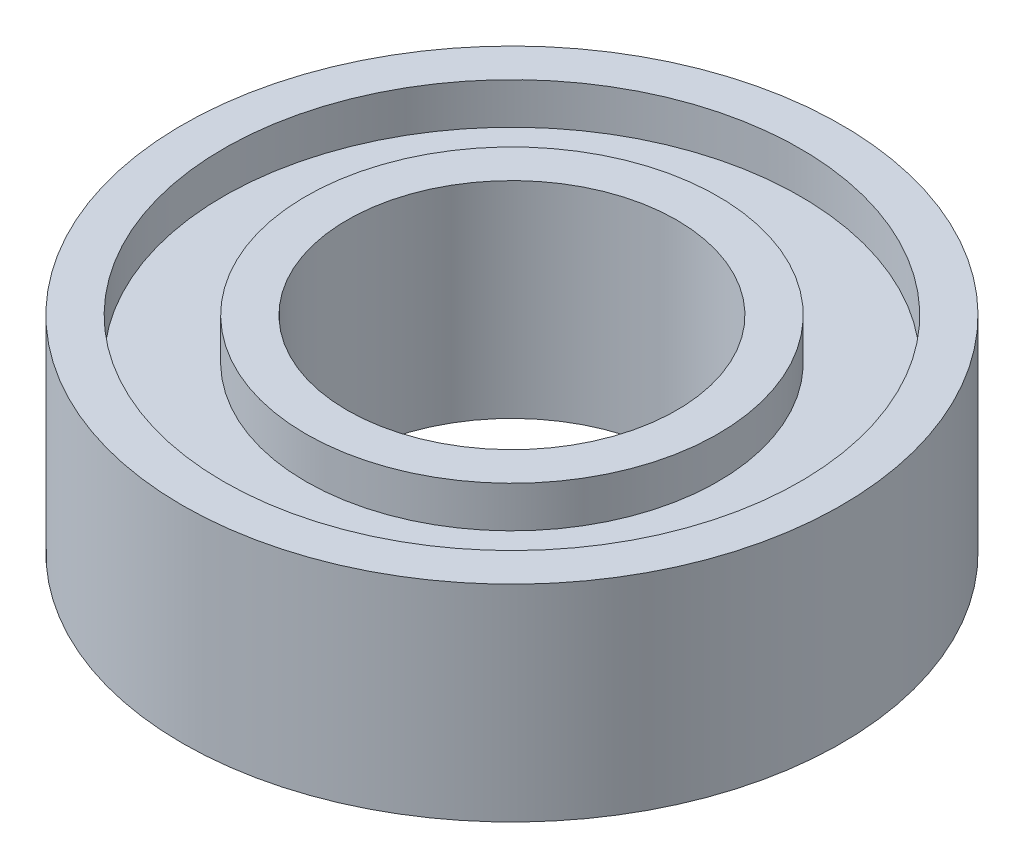
ISO-10303-21;
HEADER;
FILE_DESCRIPTION(('STEP AP214'),'2;1');
FILE_NAME('part.step','',(''),(''),'','','');
FILE_SCHEMA(('AUTOMOTIVE_DESIGN { 1 0 10303 214 1 1 1 1 }'));
ENDSEC;
DATA;
#1=APPLICATION_CONTEXT('core data for automotive mechanical design processes');
#2=APPLICATION_PROTOCOL_DEFINITION('international standard','automotive_design',2000,#1);
#3=PRODUCT_CONTEXT('',#1,'mechanical');
#4=PRODUCT('Part','Part','',(#3));
#5=PRODUCT_RELATED_PRODUCT_CATEGORY('part','',(#4));
#6=PRODUCT_DEFINITION_FORMATION('','',#4);
#7=PRODUCT_DEFINITION_CONTEXT('part definition',#1,'design');
#8=PRODUCT_DEFINITION('design','',#6,#7);
#9=PRODUCT_DEFINITION_SHAPE('','',#8);
#10=(LENGTH_UNIT() NAMED_UNIT(*) SI_UNIT(.MILLI.,.METRE.));
#11=(NAMED_UNIT(*) PLANE_ANGLE_UNIT() SI_UNIT($,.RADIAN.));
#12=(NAMED_UNIT(*) SI_UNIT($,.STERADIAN.) SOLID_ANGLE_UNIT());
#13=UNCERTAINTY_MEASURE_WITH_UNIT(LENGTH_MEASURE(1.E-05),#10,'distance_accuracy_value','');
#14=(GEOMETRIC_REPRESENTATION_CONTEXT(3) GLOBAL_UNCERTAINTY_ASSIGNED_CONTEXT((#13)) GLOBAL_UNIT_ASSIGNED_CONTEXT((#10,
#11,#12)) REPRESENTATION_CONTEXT('',''));
#15=CARTESIAN_POINT('',(0.,0.,0.));
#16=DIRECTION('',(0.,0.,1.));
#17=DIRECTION('',(1.,0.,0.));
#18=AXIS2_PLACEMENT_3D('',#15,#16,#17);
#19=CARTESIAN_POINT('',(0.,0.,0.));
#20=DIRECTION('',(0.,1.,0.));
#21=DIRECTION('',(0.,0.,1.));
#22=AXIS2_PLACEMENT_3D('',#19,#20,#21);
#23=PLANE('',#22);
#24=CARTESIAN_POINT('',(0.,0.,0.));
#25=DIRECTION('',(0.,1.,0.));
#26=DIRECTION('',(0.,0.,1.));
#27=AXIS2_PLACEMENT_3D('',#24,#25,#26);
#28=CIRCLE('',#27,4.);
#29=CARTESIAN_POINT('',(0.,0.,4.));
#30=VERTEX_POINT('',#29);
#31=EDGE_CURVE('E54',#30,#30,#28,.T.);
#32=ORIENTED_EDGE('',*,*,#31,.T.);
#33=EDGE_LOOP('',(#32));
#34=FACE_BOUND('',#33,.T.);
#35=CARTESIAN_POINT('',(0.,0.,0.));
#36=DIRECTION('',(0.,-1.,0.));
#37=DIRECTION('',(0.,0.,-1.));
#38=AXIS2_PLACEMENT_3D('',#35,#36,#37);
#39=CIRCLE('',#38,5.);
#40=CARTESIAN_POINT('',(0.,0.,-5.));
#41=VERTEX_POINT('',#40);
#42=EDGE_CURVE('E78',#41,#41,#39,.T.);
#43=ORIENTED_EDGE('',*,*,#42,.T.);
#44=EDGE_LOOP('',(#43));
#45=FACE_BOUND('',#44,.T.);
#46=ADVANCED_FACE('F41',(#34,#45),#23,.F.);
#47=CARTESIAN_POINT('',(0.,5.,0.));
#48=DIRECTION('',(0.,1.,0.));
#49=DIRECTION('',(0.,0.,1.));
#50=AXIS2_PLACEMENT_3D('',#47,#48,#49);
#51=PLANE('',#50);
#52=CARTESIAN_POINT('',(0.,5.,0.));
#53=DIRECTION('',(0.,1.,0.));
#54=DIRECTION('',(0.,0.,1.));
#55=AXIS2_PLACEMENT_3D('',#52,#53,#54);
#56=CIRCLE('',#55,4.);
#57=CARTESIAN_POINT('',(0.,5.,4.));
#58=VERTEX_POINT('',#57);
#59=EDGE_CURVE('E52',#58,#58,#56,.T.);
#60=ORIENTED_EDGE('',*,*,#59,.F.);
#61=EDGE_LOOP('',(#60));
#62=FACE_BOUND('',#61,.T.);
#63=CARTESIAN_POINT('',(0.,5.,0.));
#64=DIRECTION('',(0.,1.,0.));
#65=DIRECTION('',(0.,0.,1.));
#66=AXIS2_PLACEMENT_3D('',#63,#64,#65);
#67=CIRCLE('',#66,5.);
#68=CARTESIAN_POINT('',(0.,5.,5.));
#69=VERTEX_POINT('',#68);
#70=EDGE_CURVE('E66',#69,#69,#67,.T.);
#71=ORIENTED_EDGE('',*,*,#70,.T.);
#72=EDGE_LOOP('',(#71));
#73=FACE_BOUND('',#72,.T.);
#74=ADVANCED_FACE('F116',(#62,#73),#51,.T.);
#75=CARTESIAN_POINT('',(0.,5.,0.));
#76=DIRECTION('',(0.,1.,0.));
#77=DIRECTION('',(0.,0.,1.));
#78=AXIS2_PLACEMENT_3D('',#75,#76,#77);
#79=CIRCLE('',#78,7.);
#80=CARTESIAN_POINT('',(0.,5.,7.));
#81=VERTEX_POINT('',#80);
#82=EDGE_CURVE('E60',#81,#81,#79,.T.);
#83=ORIENTED_EDGE('',*,*,#82,.F.);
#84=EDGE_LOOP('',(#83));
#85=FACE_BOUND('',#84,.T.);
#86=CARTESIAN_POINT('',(0.,5.,0.));
#87=DIRECTION('',(0.,1.,0.));
#88=DIRECTION('',(0.,0.,1.));
#89=AXIS2_PLACEMENT_3D('',#86,#87,#88);
#90=CIRCLE('',#89,8.);
#91=CARTESIAN_POINT('',(0.,5.,8.));
#92=VERTEX_POINT('',#91);
#93=EDGE_CURVE('E10',#92,#92,#90,.T.);
#94=ORIENTED_EDGE('',*,*,#93,.T.);
#95=EDGE_LOOP('',(#94));
#96=FACE_BOUND('',#95,.T.);
#97=ADVANCED_FACE('F103',(#85,#96),#51,.T.);
#98=CARTESIAN_POINT('',(0.,0.,0.));
#99=DIRECTION('',(0.,-1.,0.));
#100=DIRECTION('',(0.,0.,-1.));
#101=AXIS2_PLACEMENT_3D('',#98,#99,#100);
#102=CIRCLE('',#101,7.);
#103=CARTESIAN_POINT('',(0.,0.,-7.));
#104=VERTEX_POINT('',#103);
#105=EDGE_CURVE('E72',#104,#104,#102,.T.);
#106=ORIENTED_EDGE('',*,*,#105,.F.);
#107=EDGE_LOOP('',(#106));
#108=FACE_BOUND('',#107,.T.);
#109=CARTESIAN_POINT('',(0.,0.,0.));
#110=DIRECTION('',(0.,1.,0.));
#111=DIRECTION('',(0.,0.,1.));
#112=AXIS2_PLACEMENT_3D('',#109,#110,#111);
#113=CIRCLE('',#112,8.);
#114=CARTESIAN_POINT('',(0.,0.,8.));
#115=VERTEX_POINT('',#114);
#116=EDGE_CURVE('E45',#115,#115,#113,.T.);
#117=ORIENTED_EDGE('',*,*,#116,.F.);
#118=EDGE_LOOP('',(#117));
#119=FACE_BOUND('',#118,.T.);
#120=ADVANCED_FACE('F100',(#108,#119),#23,.F.);
#121=CARTESIAN_POINT('',(0.,5.,0.));
#122=DIRECTION('',(0.,-1.,0.));
#123=DIRECTION('',(0.,0.,-1.));
#124=AXIS2_PLACEMENT_3D('',#121,#122,#123);
#125=CYLINDRICAL_SURFACE('',#124,8.);
#126=ORIENTED_EDGE('',*,*,#93,.F.);
#127=EDGE_LOOP('',(#126));
#128=FACE_BOUND('',#127,.T.);
#129=ORIENTED_EDGE('',*,*,#116,.T.);
#130=EDGE_LOOP('',(#129));
#131=FACE_BOUND('',#130,.T.);
#132=ADVANCED_FACE('F43',(#128,#131),#125,.T.);
#133=CARTESIAN_POINT('',(0.,5.,0.));
#134=DIRECTION('',(0.,-1.,0.));
#135=DIRECTION('',(0.,0.,-1.));
#136=AXIS2_PLACEMENT_3D('',#133,#134,#135);
#137=CYLINDRICAL_SURFACE('',#136,4.);
#138=ORIENTED_EDGE('',*,*,#59,.T.);
#139=EDGE_LOOP('',(#138));
#140=FACE_BOUND('',#139,.T.);
#141=ORIENTED_EDGE('',*,*,#31,.F.);
#142=EDGE_LOOP('',(#141));
#143=FACE_BOUND('',#142,.T.);
#144=ADVANCED_FACE('F107',(#140,#143),#137,.F.);
#145=CARTESIAN_POINT('',(0.,4.,0.));
#146=DIRECTION('',(0.,1.,0.));
#147=DIRECTION('',(0.,0.,1.));
#148=AXIS2_PLACEMENT_3D('',#145,#146,#147);
#149=CYLINDRICAL_SURFACE('',#148,7.);
#150=CARTESIAN_POINT('',(0.,4.,0.));
#151=DIRECTION('',(0.,1.,0.));
#152=DIRECTION('',(0.,0.,1.));
#153=AXIS2_PLACEMENT_3D('',#150,#151,#152);
#154=CIRCLE('',#153,7.);
#155=CARTESIAN_POINT('',(0.,4.,7.));
#156=VERTEX_POINT('',#155);
#157=EDGE_CURVE('E57',#156,#156,#154,.T.);
#158=ORIENTED_EDGE('',*,*,#157,.F.);
#159=EDGE_LOOP('',(#158));
#160=FACE_BOUND('',#159,.T.);
#161=ORIENTED_EDGE('',*,*,#82,.T.);
#162=EDGE_LOOP('',(#161));
#163=FACE_BOUND('',#162,.T.);
#164=ADVANCED_FACE('F112',(#160,#163),#149,.F.);
#165=CARTESIAN_POINT('',(0.,4.,0.));
#166=DIRECTION('',(0.,1.,0.));
#167=DIRECTION('',(0.,0.,1.));
#168=AXIS2_PLACEMENT_3D('',#165,#166,#167);
#169=PLANE('',#168);
#170=CARTESIAN_POINT('',(0.,4.,0.));
#171=DIRECTION('',(0.,1.,0.));
#172=DIRECTION('',(0.,0.,1.));
#173=AXIS2_PLACEMENT_3D('',#170,#171,#172);
#174=CIRCLE('',#173,5.);
#175=CARTESIAN_POINT('',(0.,4.,5.));
#176=VERTEX_POINT('',#175);
#177=EDGE_CURVE('E63',#176,#176,#174,.T.);
#178=ORIENTED_EDGE('',*,*,#177,.F.);
#179=EDGE_LOOP('',(#178));
#180=FACE_BOUND('',#179,.T.);
#181=ORIENTED_EDGE('',*,*,#157,.T.);
#182=EDGE_LOOP('',(#181));
#183=FACE_BOUND('',#182,.T.);
#184=ADVANCED_FACE('F130',(#180,#183),#169,.T.);
#185=CARTESIAN_POINT('',(0.,4.,0.));
#186=DIRECTION('',(0.,1.,0.));
#187=DIRECTION('',(0.,0.,1.));
#188=AXIS2_PLACEMENT_3D('',#185,#186,#187);
#189=CYLINDRICAL_SURFACE('',#188,5.);
#190=ORIENTED_EDGE('',*,*,#177,.T.);
#191=EDGE_LOOP('',(#190));
#192=FACE_BOUND('',#191,.T.);
#193=ORIENTED_EDGE('',*,*,#70,.F.);
#194=EDGE_LOOP('',(#193));
#195=FACE_BOUND('',#194,.T.);
#196=ADVANCED_FACE('F96',(#192,#195),#189,.T.);
#197=CARTESIAN_POINT('',(0.,1.,0.));
#198=DIRECTION('',(0.,-1.,0.));
#199=DIRECTION('',(0.,0.,-1.));
#200=AXIS2_PLACEMENT_3D('',#197,#198,#199);
#201=CYLINDRICAL_SURFACE('',#200,7.);
#202=CARTESIAN_POINT('',(0.,1.,0.));
#203=DIRECTION('',(0.,-1.,0.));
#204=DIRECTION('',(0.,0.,-1.));
#205=AXIS2_PLACEMENT_3D('',#202,#203,#204);
#206=CIRCLE('',#205,7.);
#207=CARTESIAN_POINT('',(0.,1.,-7.));
#208=VERTEX_POINT('',#207);
#209=EDGE_CURVE('E69',#208,#208,#206,.T.);
#210=ORIENTED_EDGE('',*,*,#209,.F.);
#211=EDGE_LOOP('',(#210));
#212=FACE_BOUND('',#211,.T.);
#213=ORIENTED_EDGE('',*,*,#105,.T.);
#214=EDGE_LOOP('',(#213));
#215=FACE_BOUND('',#214,.T.);
#216=ADVANCED_FACE('F90',(#212,#215),#201,.F.);
#217=CARTESIAN_POINT('',(0.,1.,0.));
#218=DIRECTION('',(0.,-1.,0.));
#219=DIRECTION('',(0.,0.,-1.));
#220=AXIS2_PLACEMENT_3D('',#217,#218,#219);
#221=PLANE('',#220);
#222=CARTESIAN_POINT('',(0.,1.,0.));
#223=DIRECTION('',(0.,-1.,0.));
#224=DIRECTION('',(0.,0.,-1.));
#225=AXIS2_PLACEMENT_3D('',#222,#223,#224);
#226=CIRCLE('',#225,5.);
#227=CARTESIAN_POINT('',(0.,1.,-5.));
#228=VERTEX_POINT('',#227);
#229=EDGE_CURVE('E75',#228,#228,#226,.T.);
#230=ORIENTED_EDGE('',*,*,#229,.F.);
#231=EDGE_LOOP('',(#230));
#232=FACE_BOUND('',#231,.T.);
#233=ORIENTED_EDGE('',*,*,#209,.T.);
#234=EDGE_LOOP('',(#233));
#235=FACE_BOUND('',#234,.T.);
#236=ADVANCED_FACE('F87',(#232,#235),#221,.T.);
#237=CARTESIAN_POINT('',(0.,1.,0.));
#238=DIRECTION('',(0.,-1.,0.));
#239=DIRECTION('',(0.,0.,-1.));
#240=AXIS2_PLACEMENT_3D('',#237,#238,#239);
#241=CYLINDRICAL_SURFACE('',#240,5.);
#242=ORIENTED_EDGE('',*,*,#229,.T.);
#243=EDGE_LOOP('',(#242));
#244=FACE_BOUND('',#243,.T.);
#245=ORIENTED_EDGE('',*,*,#42,.F.);
#246=EDGE_LOOP('',(#245));
#247=FACE_BOUND('',#246,.T.);
#248=ADVANCED_FACE('F84',(#244,#247),#241,.T.);
#249=CLOSED_SHELL('',(#46,#74,#97,#120,#132,#144,#164,#184,#196,#216,#236,#248));
#250=MANIFOLD_SOLID_BREP('B2',#249);
#251=ADVANCED_BREP_SHAPE_REPRESENTATION('',(#18,#250),#14);
#252=SHAPE_DEFINITION_REPRESENTATION(#9,#251);
ENDSEC;
END-ISO-10303-21;
